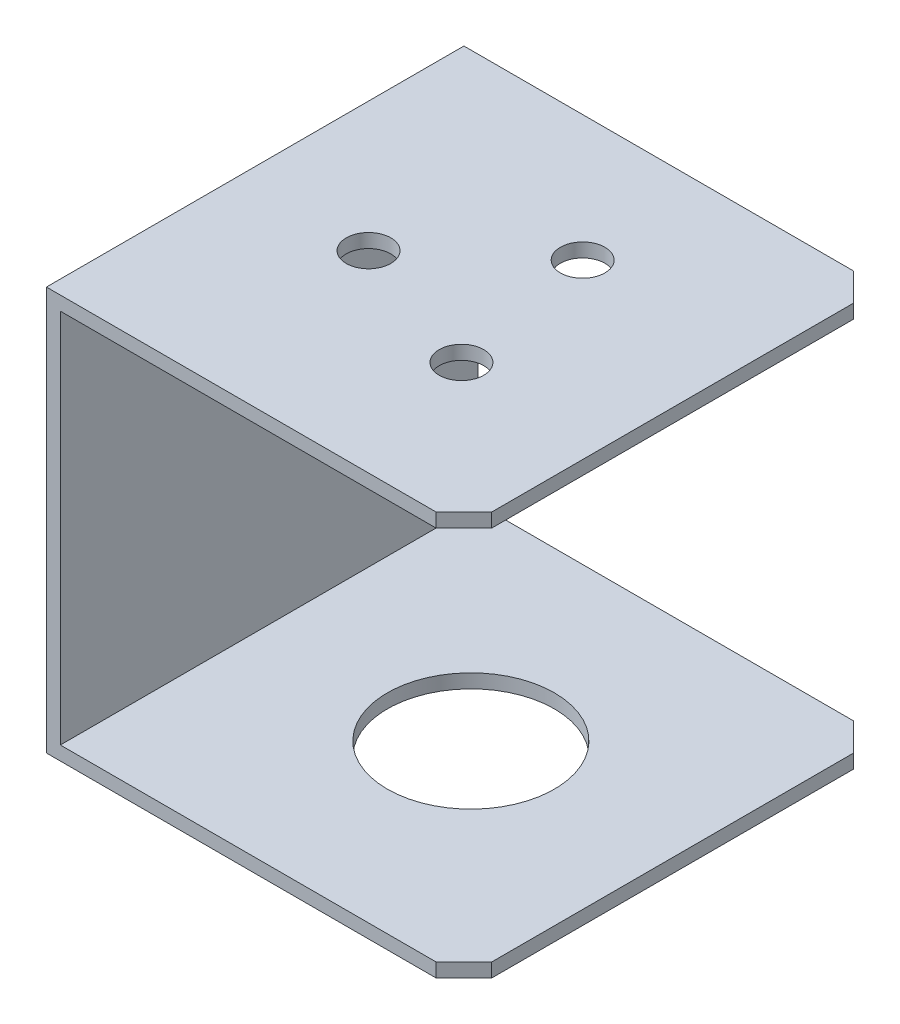
ISO-10303-21;
HEADER;
FILE_DESCRIPTION(('STEP AP214'),'2;1');
FILE_NAME('part.step','',(''),(''),'','','');
FILE_SCHEMA(('AUTOMOTIVE_DESIGN { 1 0 10303 214 1 1 1 1 }'));
ENDSEC;
DATA;
#1=APPLICATION_CONTEXT('core data for automotive mechanical design processes');
#2=APPLICATION_PROTOCOL_DEFINITION('international standard','automotive_design',2000,#1);
#3=PRODUCT_CONTEXT('',#1,'mechanical');
#4=PRODUCT('Part','Part','',(#3));
#5=PRODUCT_RELATED_PRODUCT_CATEGORY('part','',(#4));
#6=PRODUCT_DEFINITION_FORMATION('','',#4);
#7=PRODUCT_DEFINITION_CONTEXT('part definition',#1,'design');
#8=PRODUCT_DEFINITION('design','',#6,#7);
#9=PRODUCT_DEFINITION_SHAPE('','',#8);
#10=(LENGTH_UNIT() NAMED_UNIT(*) SI_UNIT(.MILLI.,.METRE.));
#11=(NAMED_UNIT(*) PLANE_ANGLE_UNIT() SI_UNIT($,.RADIAN.));
#12=(NAMED_UNIT(*) SI_UNIT($,.STERADIAN.) SOLID_ANGLE_UNIT());
#13=UNCERTAINTY_MEASURE_WITH_UNIT(LENGTH_MEASURE(1.E-05),#10,'distance_accuracy_value','');
#14=(GEOMETRIC_REPRESENTATION_CONTEXT(3) GLOBAL_UNCERTAINTY_ASSIGNED_CONTEXT((#13)) GLOBAL_UNIT_ASSIGNED_CONTEXT((#10,
#11,#12)) REPRESENTATION_CONTEXT('',''));
#15=CARTESIAN_POINT('',(0.,0.,0.));
#16=DIRECTION('',(0.,0.,1.));
#17=DIRECTION('',(1.,0.,0.));
#18=AXIS2_PLACEMENT_3D('',#15,#16,#17);
#19=CARTESIAN_POINT('',(0.,0.,30.));
#20=DIRECTION('',(0.,1.,0.));
#21=DIRECTION('',(0.,0.,1.));
#22=AXIS2_PLACEMENT_3D('',#19,#20,#21);
#23=PLANE('',#22);
#24=CARTESIAN_POINT('',(15.5,0.,15.));
#25=DIRECTION('',(0.,1.,0.));
#26=DIRECTION('',(0.,0.,1.));
#27=AXIS2_PLACEMENT_3D('',#24,#25,#26);
#28=CIRCLE('',#27,6.);
#29=CARTESIAN_POINT('',(15.5,0.,21.));
#30=VERTEX_POINT('',#29);
#31=EDGE_CURVE('E338',#30,#30,#28,.T.);
#32=ORIENTED_EDGE('',*,*,#31,.T.);
#33=EDGE_LOOP('',(#32));
#34=FACE_BOUND('',#33,.T.);
#35=DIRECTION('',(1.,0.,0.));
#36=VECTOR('',#35,1.);
#37=CARTESIAN_POINT('',(0.,0.,0.));
#38=LINE('',#37,#36);
#39=CARTESIAN_POINT('',(0.,0.,0.));
#40=VERTEX_POINT('',#39);
#41=CARTESIAN_POINT('',(28.,0.,0.));
#42=VERTEX_POINT('',#41);
#43=EDGE_CURVE('E246',#40,#42,#38,.T.);
#44=ORIENTED_EDGE('',*,*,#43,.T.);
#45=DIRECTION('',(0.707106781186549,0.,0.707106781186546));
#46=VECTOR('',#45,1.);
#47=CARTESIAN_POINT('',(30.,0.,2.));
#48=LINE('',#47,#46);
#49=CARTESIAN_POINT('',(30.,0.,2.));
#50=VERTEX_POINT('',#49);
#51=EDGE_CURVE('E192',#42,#50,#48,.T.);
#52=ORIENTED_EDGE('',*,*,#51,.T.);
#53=DIRECTION('',(0.,0.,-1.));
#54=VECTOR('',#53,1.);
#55=CARTESIAN_POINT('',(30.,0.,30.));
#56=LINE('',#55,#54);
#57=CARTESIAN_POINT('',(30.,0.,28.));
#58=VERTEX_POINT('',#57);
#59=EDGE_CURVE('E172',#58,#50,#56,.T.);
#60=ORIENTED_EDGE('',*,*,#59,.F.);
#61=DIRECTION('',(0.707106781186546,0.,-0.707106781186549));
#62=VECTOR('',#61,1.);
#63=CARTESIAN_POINT('',(28.,0.,30.));
#64=LINE('',#63,#62);
#65=CARTESIAN_POINT('',(28.,0.,30.));
#66=VERTEX_POINT('',#65);
#67=EDGE_CURVE('E150',#58,#66,#64,.F.);
#68=ORIENTED_EDGE('',*,*,#67,.T.);
#69=DIRECTION('',(1.,0.,0.));
#70=VECTOR('',#69,1.);
#71=CARTESIAN_POINT('',(0.,0.,30.));
#72=LINE('',#71,#70);
#73=CARTESIAN_POINT('',(0.,0.,30.));
#74=VERTEX_POINT('',#73);
#75=EDGE_CURVE('E143',#74,#66,#72,.T.);
#76=ORIENTED_EDGE('',*,*,#75,.F.);
#77=DIRECTION('',(0.,0.,-1.));
#78=VECTOR('',#77,1.);
#79=CARTESIAN_POINT('',(0.,0.,30.));
#80=LINE('',#79,#78);
#81=EDGE_CURVE('E147',#74,#40,#80,.T.);
#82=ORIENTED_EDGE('',*,*,#81,.T.);
#83=EDGE_LOOP('',(#44,#52,#60,#68,#76,#82));
#84=FACE_BOUND('',#83,.T.);
#85=ADVANCED_FACE('F53',(#34,#84),#23,.F.);
#86=CARTESIAN_POINT('',(30.,0.,30.));
#87=DIRECTION('',(-1.,0.,0.));
#88=DIRECTION('',(0.,0.,1.));
#89=AXIS2_PLACEMENT_3D('',#86,#87,#88);
#90=PLANE('',#89);
#91=ORIENTED_EDGE('',*,*,#59,.T.);
#92=DIRECTION('',(0.,1.,0.));
#93=VECTOR('',#92,1.);
#94=CARTESIAN_POINT('',(30.,1.,2.));
#95=LINE('',#94,#93);
#96=CARTESIAN_POINT('',(30.,1.,2.));
#97=VERTEX_POINT('',#96);
#98=EDGE_CURVE('E174',#50,#97,#95,.T.);
#99=ORIENTED_EDGE('',*,*,#98,.T.);
#100=DIRECTION('',(0.,0.,-1.));
#101=VECTOR('',#100,1.);
#102=CARTESIAN_POINT('',(30.,1.,30.));
#103=LINE('',#102,#101);
#104=CARTESIAN_POINT('',(30.,1.,28.));
#105=VERTEX_POINT('',#104);
#106=EDGE_CURVE('E177',#105,#97,#103,.T.);
#107=ORIENTED_EDGE('',*,*,#106,.F.);
#108=DIRECTION('',(0.,-1.,0.));
#109=VECTOR('',#108,1.);
#110=CARTESIAN_POINT('',(30.,0.,28.));
#111=LINE('',#110,#109);
#112=EDGE_CURVE('E171',#105,#58,#111,.T.);
#113=ORIENTED_EDGE('',*,*,#112,.T.);
#114=EDGE_LOOP('',(#91,#99,#107,#113));
#115=FACE_BOUND('',#114,.T.);
#116=ADVANCED_FACE('F233',(#115),#90,.F.);
#117=CARTESIAN_POINT('',(1.,1.,30.));
#118=DIRECTION('',(0.,-1.,0.));
#119=DIRECTION('',(0.,0.,-1.));
#120=AXIS2_PLACEMENT_3D('',#117,#118,#119);
#121=PLANE('',#120);
#122=CARTESIAN_POINT('',(15.5,1.,15.));
#123=DIRECTION('',(0.,1.,0.));
#124=DIRECTION('',(0.,0.,1.));
#125=AXIS2_PLACEMENT_3D('',#122,#123,#124);
#126=CIRCLE('',#125,6.);
#127=CARTESIAN_POINT('',(15.5,1.,21.));
#128=VERTEX_POINT('',#127);
#129=EDGE_CURVE('E343',#128,#128,#126,.T.);
#130=ORIENTED_EDGE('',*,*,#129,.F.);
#131=EDGE_LOOP('',(#130));
#132=FACE_BOUND('',#131,.T.);
#133=ORIENTED_EDGE('',*,*,#106,.T.);
#134=DIRECTION('',(-0.707106781186549,0.,-0.707106781186546));
#135=VECTOR('',#134,1.);
#136=CARTESIAN_POINT('',(30.,1.,2.));
#137=LINE('',#136,#135);
#138=CARTESIAN_POINT('',(28.,1.,0.));
#139=VERTEX_POINT('',#138);
#140=EDGE_CURVE('E185',#97,#139,#137,.T.);
#141=ORIENTED_EDGE('',*,*,#140,.T.);
#142=DIRECTION('',(-1.,0.,0.));
#143=VECTOR('',#142,1.);
#144=CARTESIAN_POINT('',(1.,1.,0.));
#145=LINE('',#144,#143);
#146=CARTESIAN_POINT('',(1.,1.,0.));
#147=VERTEX_POINT('',#146);
#148=EDGE_CURVE('E248',#139,#147,#145,.T.);
#149=ORIENTED_EDGE('',*,*,#148,.T.);
#150=DIRECTION('',(0.,0.,-1.));
#151=VECTOR('',#150,1.);
#152=CARTESIAN_POINT('',(1.,1.,30.));
#153=LINE('',#152,#151);
#154=CARTESIAN_POINT('',(1.,1.,30.));
#155=VERTEX_POINT('',#154);
#156=EDGE_CURVE('E223',#155,#147,#153,.T.);
#157=ORIENTED_EDGE('',*,*,#156,.F.);
#158=DIRECTION('',(-1.,0.,0.));
#159=VECTOR('',#158,1.);
#160=CARTESIAN_POINT('',(1.,1.,30.));
#161=LINE('',#160,#159);
#162=CARTESIAN_POINT('',(28.,1.,30.));
#163=VERTEX_POINT('',#162);
#164=EDGE_CURVE('E154',#163,#155,#161,.T.);
#165=ORIENTED_EDGE('',*,*,#164,.F.);
#166=DIRECTION('',(-0.707106781186546,0.,0.707106781186549));
#167=VECTOR('',#166,1.);
#168=CARTESIAN_POINT('',(28.,1.,30.));
#169=LINE('',#168,#167);
#170=EDGE_CURVE('E183',#163,#105,#169,.F.);
#171=ORIENTED_EDGE('',*,*,#170,.T.);
#172=EDGE_LOOP('',(#133,#141,#149,#157,#165,#171));
#173=FACE_BOUND('',#172,.T.);
#174=ADVANCED_FACE('F228',(#132,#173),#121,.F.);
#175=CARTESIAN_POINT('',(1.,1.,30.));
#176=DIRECTION('',(-1.,0.,0.));
#177=DIRECTION('',(0.,0.,1.));
#178=AXIS2_PLACEMENT_3D('',#175,#176,#177);
#179=PLANE('',#178);
#180=DIRECTION('',(0.,1.,0.));
#181=VECTOR('',#180,1.);
#182=CARTESIAN_POINT('',(1.,1.,0.));
#183=LINE('',#182,#181);
#184=CARTESIAN_POINT('',(1.,28.,0.));
#185=VERTEX_POINT('',#184);
#186=EDGE_CURVE('E251',#147,#185,#183,.T.);
#187=ORIENTED_EDGE('',*,*,#186,.T.);
#188=DIRECTION('',(0.,0.,-1.));
#189=VECTOR('',#188,1.);
#190=CARTESIAN_POINT('',(1.,28.,30.));
#191=LINE('',#190,#189);
#192=CARTESIAN_POINT('',(1.,28.,30.));
#193=VERTEX_POINT('',#192);
#194=EDGE_CURVE('E216',#193,#185,#191,.T.);
#195=ORIENTED_EDGE('',*,*,#194,.F.);
#196=DIRECTION('',(0.,1.,0.));
#197=VECTOR('',#196,1.);
#198=CARTESIAN_POINT('',(1.,1.,30.));
#199=LINE('',#198,#197);
#200=EDGE_CURVE('E239',#155,#193,#199,.T.);
#201=ORIENTED_EDGE('',*,*,#200,.F.);
#202=ORIENTED_EDGE('',*,*,#156,.T.);
#203=EDGE_LOOP('',(#187,#195,#201,#202));
#204=FACE_BOUND('',#203,.T.);
#205=ADVANCED_FACE('F289',(#204),#179,.F.);
#206=CARTESIAN_POINT('',(1.,28.,30.));
#207=DIRECTION('',(0.,1.,0.));
#208=DIRECTION('',(0.,0.,1.));
#209=AXIS2_PLACEMENT_3D('',#206,#207,#208);
#210=PLANE('',#209);
#211=CARTESIAN_POINT('',(19.6032325349515,28.,19.7805316403216));
#212=DIRECTION('',(0.,1.,0.));
#213=DIRECTION('',(0.,0.,1.));
#214=AXIS2_PLACEMENT_3D('',#211,#212,#213);
#215=CIRCLE('',#214,1.6);
#216=CARTESIAN_POINT('',(19.6032325349515,28.,21.3805316403216));
#217=VERTEX_POINT('',#216);
#218=EDGE_CURVE('E249',#217,#217,#215,.T.);
#219=ORIENTED_EDGE('',*,*,#218,.T.);
#220=EDGE_LOOP('',(#219));
#221=FACE_BOUND('',#220,.T.);
#222=CARTESIAN_POINT('',(9.30832188841049,28.,16.163237792742));
#223=DIRECTION('',(0.,1.,0.));
#224=DIRECTION('',(0.,0.,1.));
#225=AXIS2_PLACEMENT_3D('',#222,#223,#224);
#226=CIRCLE('',#225,1.6);
#227=CARTESIAN_POINT('',(9.30832188841049,28.,17.763237792742));
#228=VERTEX_POINT('',#227);
#229=EDGE_CURVE('E326',#228,#228,#226,.T.);
#230=ORIENTED_EDGE('',*,*,#229,.T.);
#231=EDGE_LOOP('',(#230));
#232=FACE_BOUND('',#231,.T.);
#233=CARTESIAN_POINT('',(17.5884455766381,28.,9.05623056693642));
#234=DIRECTION('',(0.,1.,0.));
#235=DIRECTION('',(0.,0.,1.));
#236=AXIS2_PLACEMENT_3D('',#233,#234,#235);
#237=CIRCLE('',#236,1.6);
#238=CARTESIAN_POINT('',(17.5884455766381,28.,10.6562305669364));
#239=VERTEX_POINT('',#238);
#240=EDGE_CURVE('E329',#239,#239,#237,.T.);
#241=ORIENTED_EDGE('',*,*,#240,.T.);
#242=EDGE_LOOP('',(#241));
#243=FACE_BOUND('',#242,.T.);
#244=DIRECTION('',(0.,0.,-1.));
#245=VECTOR('',#244,1.);
#246=CARTESIAN_POINT('',(30.,28.,30.));
#247=LINE('',#246,#245);
#248=CARTESIAN_POINT('',(30.,28.,28.));
#249=VERTEX_POINT('',#248);
#250=CARTESIAN_POINT('',(30.,28.,2.));
#251=VERTEX_POINT('',#250);
#252=EDGE_CURVE('E209',#249,#251,#247,.T.);
#253=ORIENTED_EDGE('',*,*,#252,.F.);
#254=DIRECTION('',(0.707106781186546,0.,-0.707106781186549));
#255=VECTOR('',#254,1.);
#256=CARTESIAN_POINT('',(28.,28.,30.));
#257=LINE('',#256,#255);
#258=CARTESIAN_POINT('',(28.,28.,30.));
#259=VERTEX_POINT('',#258);
#260=EDGE_CURVE('E13',#249,#259,#257,.F.);
#261=ORIENTED_EDGE('',*,*,#260,.T.);
#262=DIRECTION('',(1.,0.,0.));
#263=VECTOR('',#262,1.);
#264=CARTESIAN_POINT('',(1.,28.,30.));
#265=LINE('',#264,#263);
#266=EDGE_CURVE('E241',#193,#259,#265,.T.);
#267=ORIENTED_EDGE('',*,*,#266,.F.);
#268=ORIENTED_EDGE('',*,*,#194,.T.);
#269=DIRECTION('',(1.,0.,0.));
#270=VECTOR('',#269,1.);
#271=CARTESIAN_POINT('',(1.,28.,0.));
#272=LINE('',#271,#270);
#273=CARTESIAN_POINT('',(28.,28.,0.));
#274=VERTEX_POINT('',#273);
#275=EDGE_CURVE('E253',#185,#274,#272,.T.);
#276=ORIENTED_EDGE('',*,*,#275,.T.);
#277=DIRECTION('',(0.707106781186549,0.,0.707106781186546));
#278=VECTOR('',#277,1.);
#279=CARTESIAN_POINT('',(30.,28.,2.));
#280=LINE('',#279,#278);
#281=EDGE_CURVE('E62',#274,#251,#280,.T.);
#282=ORIENTED_EDGE('',*,*,#281,.T.);
#283=EDGE_LOOP('',(#253,#261,#267,#268,#276,#282));
#284=FACE_BOUND('',#283,.T.);
#285=ADVANCED_FACE('F293',(#221,#232,#243,#284),#210,.F.);
#286=CARTESIAN_POINT('',(30.,28.,30.));
#287=DIRECTION('',(-1.,0.,0.));
#288=DIRECTION('',(0.,0.,1.));
#289=AXIS2_PLACEMENT_3D('',#286,#287,#288);
#290=PLANE('',#289);
#291=DIRECTION('',(0.,0.,-1.));
#292=VECTOR('',#291,1.);
#293=CARTESIAN_POINT('',(30.,29.,30.));
#294=LINE('',#293,#292);
#295=CARTESIAN_POINT('',(30.,29.,28.));
#296=VERTEX_POINT('',#295);
#297=CARTESIAN_POINT('',(30.,29.,2.));
#298=VERTEX_POINT('',#297);
#299=EDGE_CURVE('E208',#296,#298,#294,.T.);
#300=ORIENTED_EDGE('',*,*,#299,.F.);
#301=DIRECTION('',(0.,-1.,0.));
#302=VECTOR('',#301,1.);
#303=CARTESIAN_POINT('',(30.,28.,28.));
#304=LINE('',#303,#302);
#305=EDGE_CURVE('E75',#296,#249,#304,.T.);
#306=ORIENTED_EDGE('',*,*,#305,.T.);
#307=ORIENTED_EDGE('',*,*,#252,.T.);
#308=DIRECTION('',(0.,1.,0.));
#309=VECTOR('',#308,1.);
#310=CARTESIAN_POINT('',(30.,29.,2.));
#311=LINE('',#310,#309);
#312=EDGE_CURVE('E202',#251,#298,#311,.T.);
#313=ORIENTED_EDGE('',*,*,#312,.T.);
#314=EDGE_LOOP('',(#300,#306,#307,#313));
#315=FACE_BOUND('',#314,.T.);
#316=ADVANCED_FACE('F207',(#315),#290,.F.);
#317=CARTESIAN_POINT('',(0.,29.,30.));
#318=DIRECTION('',(0.,-1.,0.));
#319=DIRECTION('',(0.,0.,-1.));
#320=AXIS2_PLACEMENT_3D('',#317,#318,#319);
#321=PLANE('',#320);
#322=CARTESIAN_POINT('',(19.6032325349515,29.,19.7805316403216));
#323=DIRECTION('',(0.,1.,0.));
#324=DIRECTION('',(0.,0.,1.));
#325=AXIS2_PLACEMENT_3D('',#322,#323,#324);
#326=CIRCLE('',#325,1.6);
#327=CARTESIAN_POINT('',(19.6032325349515,29.,21.3805316403216));
#328=VERTEX_POINT('',#327);
#329=EDGE_CURVE('E323',#328,#328,#326,.T.);
#330=ORIENTED_EDGE('',*,*,#329,.F.);
#331=EDGE_LOOP('',(#330));
#332=FACE_BOUND('',#331,.T.);
#333=CARTESIAN_POINT('',(9.30832188841049,29.,16.163237792742));
#334=DIRECTION('',(0.,1.,0.));
#335=DIRECTION('',(0.,0.,1.));
#336=AXIS2_PLACEMENT_3D('',#333,#334,#335);
#337=CIRCLE('',#336,1.6);
#338=CARTESIAN_POINT('',(9.30832188841049,29.,17.763237792742));
#339=VERTEX_POINT('',#338);
#340=EDGE_CURVE('E337',#339,#339,#337,.T.);
#341=ORIENTED_EDGE('',*,*,#340,.F.);
#342=EDGE_LOOP('',(#341));
#343=FACE_BOUND('',#342,.T.);
#344=CARTESIAN_POINT('',(17.5884455766381,29.,9.05623056693642));
#345=DIRECTION('',(0.,1.,0.));
#346=DIRECTION('',(0.,0.,1.));
#347=AXIS2_PLACEMENT_3D('',#344,#345,#346);
#348=CIRCLE('',#347,1.6);
#349=CARTESIAN_POINT('',(17.5884455766381,29.,10.6562305669364));
#350=VERTEX_POINT('',#349);
#351=EDGE_CURVE('E334',#350,#350,#348,.T.);
#352=ORIENTED_EDGE('',*,*,#351,.F.);
#353=EDGE_LOOP('',(#352));
#354=FACE_BOUND('',#353,.T.);
#355=DIRECTION('',(-1.,0.,0.));
#356=VECTOR('',#355,1.);
#357=CARTESIAN_POINT('',(0.,29.,30.));
#358=LINE('',#357,#356);
#359=CARTESIAN_POINT('',(28.,29.,30.));
#360=VERTEX_POINT('',#359);
#361=CARTESIAN_POINT('',(0.,29.,30.));
#362=VERTEX_POINT('',#361);
#363=EDGE_CURVE('E162',#360,#362,#358,.T.);
#364=ORIENTED_EDGE('',*,*,#363,.F.);
#365=DIRECTION('',(-0.707106781186546,0.,0.707106781186549));
#366=VECTOR('',#365,1.);
#367=CARTESIAN_POINT('',(28.,29.,30.));
#368=LINE('',#367,#366);
#369=EDGE_CURVE('E200',#360,#296,#368,.F.);
#370=ORIENTED_EDGE('',*,*,#369,.T.);
#371=ORIENTED_EDGE('',*,*,#299,.T.);
#372=DIRECTION('',(-0.707106781186549,0.,-0.707106781186546));
#373=VECTOR('',#372,1.);
#374=CARTESIAN_POINT('',(30.,29.,2.));
#375=LINE('',#374,#373);
#376=CARTESIAN_POINT('',(28.,29.,0.));
#377=VERTEX_POINT('',#376);
#378=EDGE_CURVE('E198',#298,#377,#375,.T.);
#379=ORIENTED_EDGE('',*,*,#378,.T.);
#380=DIRECTION('',(-1.,0.,0.));
#381=VECTOR('',#380,1.);
#382=CARTESIAN_POINT('',(0.,29.,0.));
#383=LINE('',#382,#381);
#384=CARTESIAN_POINT('',(0.,29.,0.));
#385=VERTEX_POINT('',#384);
#386=EDGE_CURVE('E255',#377,#385,#383,.T.);
#387=ORIENTED_EDGE('',*,*,#386,.T.);
#388=DIRECTION('',(0.,0.,-1.));
#389=VECTOR('',#388,1.);
#390=CARTESIAN_POINT('',(0.,29.,30.));
#391=LINE('',#390,#389);
#392=EDGE_CURVE('E214',#362,#385,#391,.T.);
#393=ORIENTED_EDGE('',*,*,#392,.F.);
#394=EDGE_LOOP('',(#364,#370,#371,#379,#387,#393));
#395=FACE_BOUND('',#394,.T.);
#396=ADVANCED_FACE('F212',(#332,#343,#354,#395),#321,.F.);
#397=CARTESIAN_POINT('',(0.,1.,30.));
#398=DIRECTION('',(1.,0.,0.));
#399=DIRECTION('',(0.,0.,-1.));
#400=AXIS2_PLACEMENT_3D('',#397,#398,#399);
#401=PLANE('',#400);
#402=DIRECTION('',(0.,-1.,0.));
#403=VECTOR('',#402,1.);
#404=CARTESIAN_POINT('',(0.,1.,0.));
#405=LINE('',#404,#403);
#406=EDGE_CURVE('E166',#385,#40,#405,.T.);
#407=ORIENTED_EDGE('',*,*,#406,.T.);
#408=ORIENTED_EDGE('',*,*,#81,.F.);
#409=DIRECTION('',(0.,-1.,0.));
#410=VECTOR('',#409,1.);
#411=CARTESIAN_POINT('',(0.,0.,30.));
#412=LINE('',#411,#410);
#413=EDGE_CURVE('E155',#362,#74,#412,.T.);
#414=ORIENTED_EDGE('',*,*,#413,.F.);
#415=ORIENTED_EDGE('',*,*,#392,.T.);
#416=EDGE_LOOP('',(#407,#408,#414,#415));
#417=FACE_BOUND('',#416,.T.);
#418=ADVANCED_FACE('F168',(#417),#401,.F.);
#419=CARTESIAN_POINT('',(0.,0.,30.));
#420=DIRECTION('',(0.,0.,-1.));
#421=DIRECTION('',(-1.,0.,0.));
#422=AXIS2_PLACEMENT_3D('',#419,#420,#421);
#423=PLANE('',#422);
#424=ORIENTED_EDGE('',*,*,#266,.T.);
#425=DIRECTION('',(0.,1.,0.));
#426=VECTOR('',#425,1.);
#427=CARTESIAN_POINT('',(28.,0.,30.));
#428=LINE('',#427,#426);
#429=EDGE_CURVE('E196',#259,#360,#428,.T.);
#430=ORIENTED_EDGE('',*,*,#429,.T.);
#431=ORIENTED_EDGE('',*,*,#363,.T.);
#432=ORIENTED_EDGE('',*,*,#413,.T.);
#433=ORIENTED_EDGE('',*,*,#75,.T.);
#434=DIRECTION('',(0.,1.,0.));
#435=VECTOR('',#434,1.);
#436=CARTESIAN_POINT('',(28.,0.,30.));
#437=LINE('',#436,#435);
#438=EDGE_CURVE('E194',#66,#163,#437,.T.);
#439=ORIENTED_EDGE('',*,*,#438,.T.);
#440=ORIENTED_EDGE('',*,*,#164,.T.);
#441=ORIENTED_EDGE('',*,*,#200,.T.);
#442=EDGE_LOOP('',(#424,#430,#431,#432,#433,#439,#440,#441));
#443=FACE_BOUND('',#442,.T.);
#444=ADVANCED_FACE('F159',(#443),#423,.F.);
#445=CARTESIAN_POINT('',(0.,0.,0.));
#446=DIRECTION('',(0.,0.,-1.));
#447=DIRECTION('',(-1.,0.,0.));
#448=AXIS2_PLACEMENT_3D('',#445,#446,#447);
#449=PLANE('',#448);
#450=ORIENTED_EDGE('',*,*,#148,.F.);
#451=DIRECTION('',(0.,-1.,0.));
#452=VECTOR('',#451,1.);
#453=CARTESIAN_POINT('',(28.,0.,0.));
#454=LINE('',#453,#452);
#455=EDGE_CURVE('E189',#139,#42,#454,.T.);
#456=ORIENTED_EDGE('',*,*,#455,.T.);
#457=ORIENTED_EDGE('',*,*,#43,.F.);
#458=ORIENTED_EDGE('',*,*,#406,.F.);
#459=ORIENTED_EDGE('',*,*,#386,.F.);
#460=DIRECTION('',(0.,-1.,0.));
#461=VECTOR('',#460,1.);
#462=CARTESIAN_POINT('',(28.,28.,0.));
#463=LINE('',#462,#461);
#464=EDGE_CURVE('E187',#377,#274,#463,.T.);
#465=ORIENTED_EDGE('',*,*,#464,.T.);
#466=ORIENTED_EDGE('',*,*,#275,.F.);
#467=ORIENTED_EDGE('',*,*,#186,.F.);
#468=EDGE_LOOP('',(#450,#456,#457,#458,#459,#465,#466,#467));
#469=FACE_BOUND('',#468,.T.);
#470=ADVANCED_FACE('F258',(#469),#449,.T.);
#471=CARTESIAN_POINT('',(17.5884455766381,19.,9.05623056693642));
#472=DIRECTION('',(0.,1.,0.));
#473=DIRECTION('',(0.,0.,1.));
#474=AXIS2_PLACEMENT_3D('',#471,#472,#473);
#475=CYLINDRICAL_SURFACE('',#474,1.6);
#476=ORIENTED_EDGE('',*,*,#351,.T.);
#477=EDGE_LOOP('',(#476));
#478=FACE_BOUND('',#477,.T.);
#479=ORIENTED_EDGE('',*,*,#240,.F.);
#480=EDGE_LOOP('',(#479));
#481=FACE_BOUND('',#480,.T.);
#482=ADVANCED_FACE('F306',(#478,#481),#475,.F.);
#483=CARTESIAN_POINT('',(9.30832188841049,19.,16.163237792742));
#484=DIRECTION('',(0.,1.,0.));
#485=DIRECTION('',(0.,0.,1.));
#486=AXIS2_PLACEMENT_3D('',#483,#484,#485);
#487=CYLINDRICAL_SURFACE('',#486,1.6);
#488=ORIENTED_EDGE('',*,*,#340,.T.);
#489=EDGE_LOOP('',(#488));
#490=FACE_BOUND('',#489,.T.);
#491=ORIENTED_EDGE('',*,*,#229,.F.);
#492=EDGE_LOOP('',(#491));
#493=FACE_BOUND('',#492,.T.);
#494=ADVANCED_FACE('F311',(#490,#493),#487,.F.);
#495=CARTESIAN_POINT('',(19.6032325349515,19.,19.7805316403216));
#496=DIRECTION('',(0.,1.,0.));
#497=DIRECTION('',(0.,0.,1.));
#498=AXIS2_PLACEMENT_3D('',#495,#496,#497);
#499=CYLINDRICAL_SURFACE('',#498,1.6);
#500=ORIENTED_EDGE('',*,*,#329,.T.);
#501=EDGE_LOOP('',(#500));
#502=FACE_BOUND('',#501,.T.);
#503=ORIENTED_EDGE('',*,*,#218,.F.);
#504=EDGE_LOOP('',(#503));
#505=FACE_BOUND('',#504,.T.);
#506=ADVANCED_FACE('F274',(#502,#505),#499,.F.);
#507=CARTESIAN_POINT('',(15.5,-9.,15.));
#508=DIRECTION('',(0.,1.,0.));
#509=DIRECTION('',(0.,0.,1.));
#510=AXIS2_PLACEMENT_3D('',#507,#508,#509);
#511=CYLINDRICAL_SURFACE('',#510,6.);
#512=ORIENTED_EDGE('',*,*,#129,.T.);
#513=EDGE_LOOP('',(#512));
#514=FACE_BOUND('',#513,.T.);
#515=ORIENTED_EDGE('',*,*,#31,.F.);
#516=EDGE_LOOP('',(#515));
#517=FACE_BOUND('',#516,.T.);
#518=ADVANCED_FACE('F265',(#514,#517),#511,.F.);
#519=CARTESIAN_POINT('',(30.,0.,2.));
#520=DIRECTION('',(0.707106781186546,0.,-0.707106781186549));
#521=DIRECTION('',(0.,-1.,0.));
#522=AXIS2_PLACEMENT_3D('',#519,#520,#521);
#523=PLANE('',#522);
#524=ORIENTED_EDGE('',*,*,#51,.F.);
#525=ORIENTED_EDGE('',*,*,#455,.F.);
#526=ORIENTED_EDGE('',*,*,#140,.F.);
#527=ORIENTED_EDGE('',*,*,#98,.F.);
#528=EDGE_LOOP('',(#524,#525,#526,#527));
#529=FACE_BOUND('',#528,.T.);
#530=ADVANCED_FACE('F262',(#529),#523,.T.);
#531=CARTESIAN_POINT('',(28.,0.,30.));
#532=DIRECTION('',(-0.707106781186549,0.,-0.707106781186546));
#533=DIRECTION('',(0.,1.,0.));
#534=AXIS2_PLACEMENT_3D('',#531,#532,#533);
#535=PLANE('',#534);
#536=ORIENTED_EDGE('',*,*,#260,.F.);
#537=ORIENTED_EDGE('',*,*,#305,.F.);
#538=ORIENTED_EDGE('',*,*,#369,.F.);
#539=ORIENTED_EDGE('',*,*,#429,.F.);
#540=EDGE_LOOP('',(#536,#537,#538,#539));
#541=FACE_BOUND('',#540,.T.);
#542=ADVANCED_FACE('F264',(#541),#535,.F.);
#543=CARTESIAN_POINT('',(28.,0.,30.));
#544=DIRECTION('',(-0.707106781186549,0.,-0.707106781186546));
#545=DIRECTION('',(0.,1.,0.));
#546=AXIS2_PLACEMENT_3D('',#543,#544,#545);
#547=PLANE('',#546);
#548=ORIENTED_EDGE('',*,*,#67,.F.);
#549=ORIENTED_EDGE('',*,*,#112,.F.);
#550=ORIENTED_EDGE('',*,*,#170,.F.);
#551=ORIENTED_EDGE('',*,*,#438,.F.);
#552=EDGE_LOOP('',(#548,#549,#550,#551));
#553=FACE_BOUND('',#552,.T.);
#554=ADVANCED_FACE('F236',(#553),#547,.F.);
#555=CARTESIAN_POINT('',(30.,28.,2.));
#556=DIRECTION('',(0.707106781186546,0.,-0.707106781186549));
#557=DIRECTION('',(0.,-1.,0.));
#558=AXIS2_PLACEMENT_3D('',#555,#556,#557);
#559=PLANE('',#558);
#560=ORIENTED_EDGE('',*,*,#281,.F.);
#561=ORIENTED_EDGE('',*,*,#464,.F.);
#562=ORIENTED_EDGE('',*,*,#378,.F.);
#563=ORIENTED_EDGE('',*,*,#312,.F.);
#564=EDGE_LOOP('',(#560,#561,#562,#563));
#565=FACE_BOUND('',#564,.T.);
#566=ADVANCED_FACE('F56',(#565),#559,.T.);
#567=CLOSED_SHELL('',(#85,#116,#174,#205,#285,#316,#396,#418,#444,#470,#482,#494,#506,#518,#530,
#542,#554,#566));
#568=MANIFOLD_SOLID_BREP('B2',#567);
#569=ADVANCED_BREP_SHAPE_REPRESENTATION('',(#18,#568),#14);
#570=SHAPE_DEFINITION_REPRESENTATION(#9,#569);
ENDSEC;
END-ISO-10303-21;
